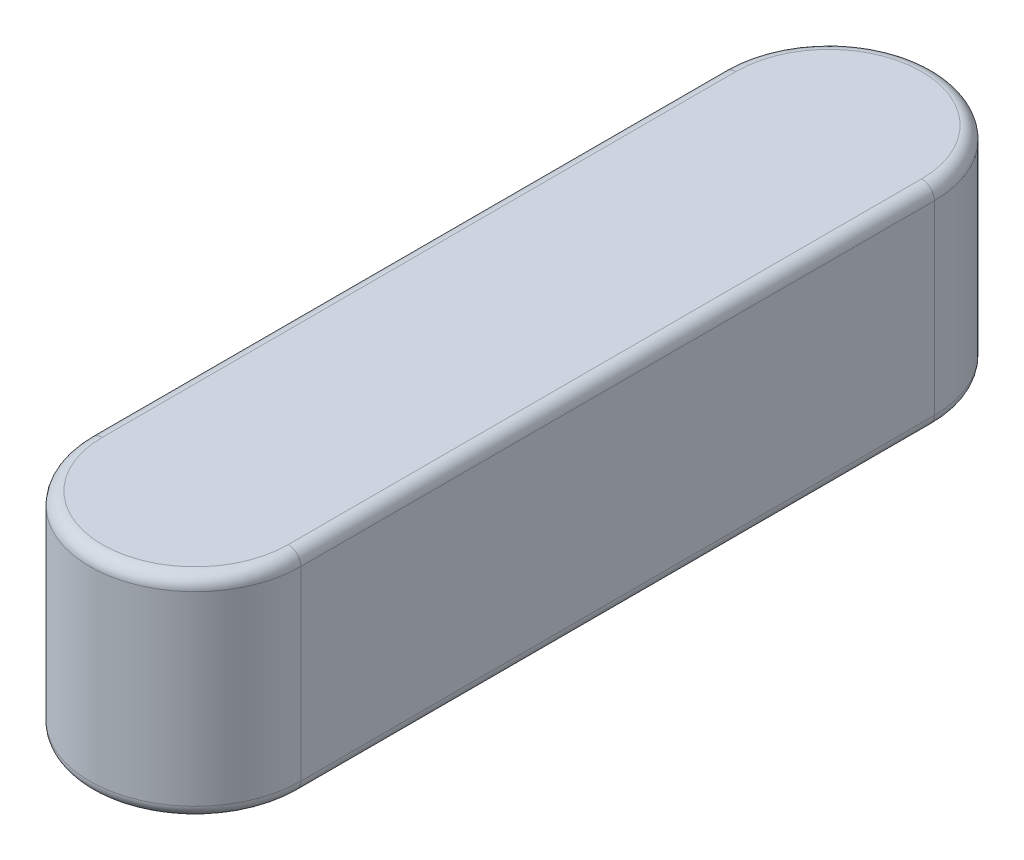
ISO-10303-21;
HEADER;
FILE_DESCRIPTION(('STEP AP214'),'2;1');
FILE_NAME('part.step','',(''),(''),'','','');
FILE_SCHEMA(('AUTOMOTIVE_DESIGN { 1 0 10303 214 1 1 1 1 }'));
ENDSEC;
DATA;
#1=APPLICATION_CONTEXT('core data for automotive mechanical design processes');
#2=APPLICATION_PROTOCOL_DEFINITION('international standard','automotive_design',2000,#1);
#3=PRODUCT_CONTEXT('',#1,'mechanical');
#4=PRODUCT('Part','Part','',(#3));
#5=PRODUCT_RELATED_PRODUCT_CATEGORY('part','',(#4));
#6=PRODUCT_DEFINITION_FORMATION('','',#4);
#7=PRODUCT_DEFINITION_CONTEXT('part definition',#1,'design');
#8=PRODUCT_DEFINITION('design','',#6,#7);
#9=PRODUCT_DEFINITION_SHAPE('','',#8);
#10=(LENGTH_UNIT() NAMED_UNIT(*) SI_UNIT(.MILLI.,.METRE.));
#11=(NAMED_UNIT(*) PLANE_ANGLE_UNIT() SI_UNIT($,.RADIAN.));
#12=(NAMED_UNIT(*) SI_UNIT($,.STERADIAN.) SOLID_ANGLE_UNIT());
#13=UNCERTAINTY_MEASURE_WITH_UNIT(LENGTH_MEASURE(1.E-05),#10,'distance_accuracy_value','');
#14=(GEOMETRIC_REPRESENTATION_CONTEXT(3) GLOBAL_UNCERTAINTY_ASSIGNED_CONTEXT((#13)) GLOBAL_UNIT_ASSIGNED_CONTEXT((#10,
#11,#12)) REPRESENTATION_CONTEXT('',''));
#15=CARTESIAN_POINT('',(0.,0.,0.));
#16=DIRECTION('',(0.,0.,1.));
#17=DIRECTION('',(1.,0.,0.));
#18=AXIS2_PLACEMENT_3D('',#15,#16,#17);
#19=CARTESIAN_POINT('',(0.,-2.5,-7.5));
#20=DIRECTION('',(0.,1.,0.));
#21=DIRECTION('',(0.,0.,1.));
#22=AXIS2_PLACEMENT_3D('',#19,#20,#21);
#23=CYLINDRICAL_SURFACE('',#22,2.5);
#24=DIRECTION('',(0.,-1.,0.));
#25=VECTOR('',#24,1.);
#26=CARTESIAN_POINT('',(2.5,-2.5,-7.5));
#27=LINE('',#26,#25);
#28=CARTESIAN_POINT('',(2.5,-2.2,-7.5));
#29=VERTEX_POINT('',#28);
#30=CARTESIAN_POINT('',(2.5,2.2,-7.5));
#31=VERTEX_POINT('',#30);
#32=EDGE_CURVE('E183',#29,#31,#27,.F.);
#33=ORIENTED_EDGE('',*,*,#32,.F.);
#34=CARTESIAN_POINT('',(0.,-2.2,-7.5));
#35=DIRECTION('',(0.,1.,0.));
#36=DIRECTION('',(0.,0.,1.));
#37=AXIS2_PLACEMENT_3D('',#34,#35,#36);
#38=CIRCLE('',#37,2.5);
#39=CARTESIAN_POINT('',(-2.5,-2.2,-7.5));
#40=VERTEX_POINT('',#39);
#41=EDGE_CURVE('E148',#29,#40,#38,.T.);
#42=ORIENTED_EDGE('',*,*,#41,.T.);
#43=DIRECTION('',(0.,-1.,0.));
#44=VECTOR('',#43,1.);
#45=CARTESIAN_POINT('',(-2.5,-2.5,-7.5));
#46=LINE('',#45,#44);
#47=CARTESIAN_POINT('',(-2.5,2.2,-7.5));
#48=VERTEX_POINT('',#47);
#49=EDGE_CURVE('E128',#48,#40,#46,.T.);
#50=ORIENTED_EDGE('',*,*,#49,.F.);
#51=CARTESIAN_POINT('',(0.,2.2,-7.5));
#52=DIRECTION('',(0.,-1.,0.));
#53=DIRECTION('',(0.,0.,-1.));
#54=AXIS2_PLACEMENT_3D('',#51,#52,#53);
#55=CIRCLE('',#54,2.5);
#56=EDGE_CURVE('E146',#48,#31,#55,.T.);
#57=ORIENTED_EDGE('',*,*,#56,.T.);
#58=EDGE_LOOP('',(#33,#42,#50,#57));
#59=FACE_BOUND('',#58,.T.);
#60=ADVANCED_FACE('F43',(#59),#23,.T.);
#61=CARTESIAN_POINT('',(0.,2.5,7.5));
#62=DIRECTION('',(0.,1.,0.));
#63=DIRECTION('',(0.,0.,1.));
#64=AXIS2_PLACEMENT_3D('',#61,#62,#63);
#65=CYLINDRICAL_SURFACE('',#64,2.5);
#66=DIRECTION('',(0.,1.,0.));
#67=VECTOR('',#66,1.);
#68=CARTESIAN_POINT('',(-2.5,-2.5,7.5));
#69=LINE('',#68,#67);
#70=CARTESIAN_POINT('',(-2.5,-2.2,7.5));
#71=VERTEX_POINT('',#70);
#72=CARTESIAN_POINT('',(-2.5,2.2,7.5));
#73=VERTEX_POINT('',#72);
#74=EDGE_CURVE('E191',#71,#73,#69,.T.);
#75=ORIENTED_EDGE('',*,*,#74,.F.);
#76=CARTESIAN_POINT('',(0.,-2.2,7.5));
#77=DIRECTION('',(0.,1.,0.));
#78=DIRECTION('',(0.,0.,1.));
#79=AXIS2_PLACEMENT_3D('',#76,#77,#78);
#80=CIRCLE('',#79,2.5);
#81=CARTESIAN_POINT('',(2.5,-2.2,7.5));
#82=VERTEX_POINT('',#81);
#83=EDGE_CURVE('E115',#71,#82,#80,.T.);
#84=ORIENTED_EDGE('',*,*,#83,.T.);
#85=DIRECTION('',(0.,1.,0.));
#86=VECTOR('',#85,1.);
#87=CARTESIAN_POINT('',(2.5,-2.5,7.5));
#88=LINE('',#87,#86);
#89=CARTESIAN_POINT('',(2.5,2.2,7.5));
#90=VERTEX_POINT('',#89);
#91=EDGE_CURVE('E163',#90,#82,#88,.F.);
#92=ORIENTED_EDGE('',*,*,#91,.F.);
#93=CARTESIAN_POINT('',(0.,2.2,7.5));
#94=DIRECTION('',(0.,-1.,0.));
#95=DIRECTION('',(0.,0.,-1.));
#96=AXIS2_PLACEMENT_3D('',#93,#94,#95);
#97=CIRCLE('',#96,2.5);
#98=EDGE_CURVE('E134',#90,#73,#97,.T.);
#99=ORIENTED_EDGE('',*,*,#98,.T.);
#100=EDGE_LOOP('',(#75,#84,#92,#99));
#101=FACE_BOUND('',#100,.T.);
#102=ADVANCED_FACE('F204',(#101),#65,.T.);
#103=CARTESIAN_POINT('',(2.5,-2.5,10.));
#104=DIRECTION('',(-1.,0.,0.));
#105=DIRECTION('',(0.,0.,1.));
#106=AXIS2_PLACEMENT_3D('',#103,#104,#105);
#107=PLANE('',#106);
#108=ORIENTED_EDGE('',*,*,#91,.T.);
#109=DIRECTION('',(0.,0.,-1.));
#110=VECTOR('',#109,1.);
#111=CARTESIAN_POINT('',(2.5,-2.2,10.));
#112=LINE('',#111,#110);
#113=EDGE_CURVE('E144',#82,#29,#112,.T.);
#114=ORIENTED_EDGE('',*,*,#113,.T.);
#115=ORIENTED_EDGE('',*,*,#32,.T.);
#116=DIRECTION('',(0.,0.,-1.));
#117=VECTOR('',#116,1.);
#118=CARTESIAN_POINT('',(2.5,2.2,10.));
#119=LINE('',#118,#117);
#120=EDGE_CURVE('E142',#31,#90,#119,.F.);
#121=ORIENTED_EDGE('',*,*,#120,.T.);
#122=EDGE_LOOP('',(#108,#114,#115,#121));
#123=FACE_BOUND('',#122,.T.);
#124=ADVANCED_FACE('F188',(#123),#107,.F.);
#125=CARTESIAN_POINT('',(-2.5,2.5,10.));
#126=DIRECTION('',(0.,-1.,0.));
#127=DIRECTION('',(0.,0.,-1.));
#128=AXIS2_PLACEMENT_3D('',#125,#126,#127);
#129=PLANE('',#128);
#130=DIRECTION('',(0.,0.,-1.));
#131=VECTOR('',#130,1.);
#132=CARTESIAN_POINT('',(-2.2,2.5,10.));
#133=LINE('',#132,#131);
#134=CARTESIAN_POINT('',(-2.2,2.5,-7.5));
#135=VERTEX_POINT('',#134);
#136=CARTESIAN_POINT('',(-2.2,2.5,7.5));
#137=VERTEX_POINT('',#136);
#138=EDGE_CURVE('E52',#135,#137,#133,.F.);
#139=ORIENTED_EDGE('',*,*,#138,.T.);
#140=CARTESIAN_POINT('',(0.,2.5,7.5));
#141=DIRECTION('',(0.,-1.,0.));
#142=DIRECTION('',(0.,0.,-1.));
#143=AXIS2_PLACEMENT_3D('',#140,#141,#142);
#144=CIRCLE('',#143,2.2);
#145=CARTESIAN_POINT('',(2.2,2.5,7.5));
#146=VERTEX_POINT('',#145);
#147=EDGE_CURVE('E11',#137,#146,#144,.F.);
#148=ORIENTED_EDGE('',*,*,#147,.T.);
#149=DIRECTION('',(0.,0.,-1.));
#150=VECTOR('',#149,1.);
#151=CARTESIAN_POINT('',(2.2,2.5,10.));
#152=LINE('',#151,#150);
#153=CARTESIAN_POINT('',(2.2,2.5,-7.5));
#154=VERTEX_POINT('',#153);
#155=EDGE_CURVE('E154',#146,#154,#152,.T.);
#156=ORIENTED_EDGE('',*,*,#155,.T.);
#157=CARTESIAN_POINT('',(0.,2.5,-7.5));
#158=DIRECTION('',(0.,-1.,0.));
#159=DIRECTION('',(0.,0.,-1.));
#160=AXIS2_PLACEMENT_3D('',#157,#158,#159);
#161=CIRCLE('',#160,2.2);
#162=EDGE_CURVE('E63',#154,#135,#161,.F.);
#163=ORIENTED_EDGE('',*,*,#162,.T.);
#164=EDGE_LOOP('',(#139,#148,#156,#163));
#165=FACE_BOUND('',#164,.T.);
#166=ADVANCED_FACE('F209',(#165),#129,.F.);
#167=CARTESIAN_POINT('',(-2.5,-2.5,10.));
#168=DIRECTION('',(1.,0.,0.));
#169=DIRECTION('',(0.,0.,-1.));
#170=AXIS2_PLACEMENT_3D('',#167,#168,#169);
#171=PLANE('',#170);
#172=ORIENTED_EDGE('',*,*,#49,.T.);
#173=DIRECTION('',(0.,0.,-1.));
#174=VECTOR('',#173,1.);
#175=CARTESIAN_POINT('',(-2.5,-2.2,10.));
#176=LINE('',#175,#174);
#177=EDGE_CURVE('E152',#40,#71,#176,.F.);
#178=ORIENTED_EDGE('',*,*,#177,.T.);
#179=ORIENTED_EDGE('',*,*,#74,.T.);
#180=DIRECTION('',(0.,0.,-1.));
#181=VECTOR('',#180,1.);
#182=CARTESIAN_POINT('',(-2.5,2.2,10.));
#183=LINE('',#182,#181);
#184=EDGE_CURVE('E150',#73,#48,#183,.T.);
#185=ORIENTED_EDGE('',*,*,#184,.T.);
#186=EDGE_LOOP('',(#172,#178,#179,#185));
#187=FACE_BOUND('',#186,.T.);
#188=ADVANCED_FACE('F207',(#187),#171,.F.);
#189=CARTESIAN_POINT('',(-2.5,-2.5,10.));
#190=DIRECTION('',(0.,1.,0.));
#191=DIRECTION('',(0.,0.,1.));
#192=AXIS2_PLACEMENT_3D('',#189,#190,#191);
#193=PLANE('',#192);
#194=DIRECTION('',(0.,0.,-1.));
#195=VECTOR('',#194,1.);
#196=CARTESIAN_POINT('',(2.2,-2.5,10.));
#197=LINE('',#196,#195);
#198=CARTESIAN_POINT('',(2.2,-2.5,-7.5));
#199=VERTEX_POINT('',#198);
#200=CARTESIAN_POINT('',(2.2,-2.5,7.5));
#201=VERTEX_POINT('',#200);
#202=EDGE_CURVE('E132',#199,#201,#197,.F.);
#203=ORIENTED_EDGE('',*,*,#202,.T.);
#204=CARTESIAN_POINT('',(0.,-2.5,7.5));
#205=DIRECTION('',(0.,1.,0.));
#206=DIRECTION('',(0.,0.,1.));
#207=AXIS2_PLACEMENT_3D('',#204,#205,#206);
#208=CIRCLE('',#207,2.2);
#209=CARTESIAN_POINT('',(-2.2,-2.5,7.5));
#210=VERTEX_POINT('',#209);
#211=EDGE_CURVE('E113',#201,#210,#208,.F.);
#212=ORIENTED_EDGE('',*,*,#211,.T.);
#213=DIRECTION('',(0.,0.,-1.));
#214=VECTOR('',#213,1.);
#215=CARTESIAN_POINT('',(-2.2,-2.5,10.));
#216=LINE('',#215,#214);
#217=CARTESIAN_POINT('',(-2.2,-2.5,-7.5));
#218=VERTEX_POINT('',#217);
#219=EDGE_CURVE('E121',#210,#218,#216,.T.);
#220=ORIENTED_EDGE('',*,*,#219,.T.);
#221=CARTESIAN_POINT('',(0.,-2.5,-7.5));
#222=DIRECTION('',(0.,1.,0.));
#223=DIRECTION('',(0.,0.,1.));
#224=AXIS2_PLACEMENT_3D('',#221,#222,#223);
#225=CIRCLE('',#224,2.2);
#226=EDGE_CURVE('E127',#218,#199,#225,.F.);
#227=ORIENTED_EDGE('',*,*,#226,.T.);
#228=EDGE_LOOP('',(#203,#212,#220,#227));
#229=FACE_BOUND('',#228,.T.);
#230=ADVANCED_FACE('F130',(#229),#193,.F.);
#231=CARTESIAN_POINT('',(0.,-2.2,-7.5));
#232=DIRECTION('',(0.,1.,0.));
#233=DIRECTION('',(0.,0.,1.));
#234=AXIS2_PLACEMENT_3D('',#231,#232,#233);
#235=TOROIDAL_SURFACE('',#234,2.2,0.3);
#236=CARTESIAN_POINT('',(-2.2,-2.2,-7.5));
#237=DIRECTION('',(0.,0.,1.));
#238=DIRECTION('',(1.,0.,0.));
#239=AXIS2_PLACEMENT_3D('',#236,#237,#238);
#240=CIRCLE('',#239,0.3);
#241=EDGE_CURVE('E124',#40,#218,#240,.T.);
#242=ORIENTED_EDGE('',*,*,#241,.F.);
#243=ORIENTED_EDGE('',*,*,#41,.F.);
#244=CARTESIAN_POINT('',(2.2,-2.2,-7.5));
#245=DIRECTION('',(0.,0.,1.));
#246=DIRECTION('',(1.,0.,0.));
#247=AXIS2_PLACEMENT_3D('',#244,#245,#246);
#248=CIRCLE('',#247,0.3);
#249=EDGE_CURVE('E160',#199,#29,#248,.T.);
#250=ORIENTED_EDGE('',*,*,#249,.F.);
#251=ORIENTED_EDGE('',*,*,#226,.F.);
#252=EDGE_LOOP('',(#242,#243,#250,#251));
#253=FACE_BOUND('',#252,.T.);
#254=ADVANCED_FACE('F199',(#253),#235,.T.);
#255=CARTESIAN_POINT('',(2.2,-2.2,10.));
#256=DIRECTION('',(0.,0.,-1.));
#257=DIRECTION('',(-1.,0.,0.));
#258=AXIS2_PLACEMENT_3D('',#255,#256,#257);
#259=CYLINDRICAL_SURFACE('',#258,0.3);
#260=ORIENTED_EDGE('',*,*,#249,.T.);
#261=ORIENTED_EDGE('',*,*,#113,.F.);
#262=CARTESIAN_POINT('',(2.2,-2.2,7.5));
#263=DIRECTION('',(0.,0.,1.));
#264=DIRECTION('',(1.,0.,0.));
#265=AXIS2_PLACEMENT_3D('',#262,#263,#264);
#266=CIRCLE('',#265,0.3);
#267=EDGE_CURVE('E118',#201,#82,#266,.T.);
#268=ORIENTED_EDGE('',*,*,#267,.F.);
#269=ORIENTED_EDGE('',*,*,#202,.F.);
#270=EDGE_LOOP('',(#260,#261,#268,#269));
#271=FACE_BOUND('',#270,.T.);
#272=ADVANCED_FACE('F201',(#271),#259,.T.);
#273=CARTESIAN_POINT('',(-2.2,-2.2,10.));
#274=DIRECTION('',(0.,0.,-1.));
#275=DIRECTION('',(-1.,0.,0.));
#276=AXIS2_PLACEMENT_3D('',#273,#274,#275);
#277=CYLINDRICAL_SURFACE('',#276,0.3);
#278=ORIENTED_EDGE('',*,*,#241,.T.);
#279=ORIENTED_EDGE('',*,*,#219,.F.);
#280=CARTESIAN_POINT('',(-2.2,-2.2,7.5));
#281=DIRECTION('',(0.,0.,1.));
#282=DIRECTION('',(1.,0.,0.));
#283=AXIS2_PLACEMENT_3D('',#280,#281,#282);
#284=CIRCLE('',#283,0.3);
#285=EDGE_CURVE('E109',#71,#210,#284,.T.);
#286=ORIENTED_EDGE('',*,*,#285,.F.);
#287=ORIENTED_EDGE('',*,*,#177,.F.);
#288=EDGE_LOOP('',(#278,#279,#286,#287));
#289=FACE_BOUND('',#288,.T.);
#290=ADVANCED_FACE('F122',(#289),#277,.T.);
#291=CARTESIAN_POINT('',(0.,-2.2,7.5));
#292=DIRECTION('',(0.,1.,0.));
#293=DIRECTION('',(0.,0.,1.));
#294=AXIS2_PLACEMENT_3D('',#291,#292,#293);
#295=TOROIDAL_SURFACE('',#294,2.2,0.3);
#296=ORIENTED_EDGE('',*,*,#267,.T.);
#297=ORIENTED_EDGE('',*,*,#83,.F.);
#298=ORIENTED_EDGE('',*,*,#285,.T.);
#299=ORIENTED_EDGE('',*,*,#211,.F.);
#300=EDGE_LOOP('',(#296,#297,#298,#299));
#301=FACE_BOUND('',#300,.T.);
#302=ADVANCED_FACE('F111',(#301),#295,.T.);
#303=CARTESIAN_POINT('',(0.,2.2,-7.5));
#304=DIRECTION('',(0.,-1.,0.));
#305=DIRECTION('',(0.,0.,-1.));
#306=AXIS2_PLACEMENT_3D('',#303,#304,#305);
#307=TOROIDAL_SURFACE('',#306,2.2,0.3);
#308=CARTESIAN_POINT('',(2.2,2.2,-7.5));
#309=DIRECTION('',(0.,0.,1.));
#310=DIRECTION('',(1.,0.,0.));
#311=AXIS2_PLACEMENT_3D('',#308,#309,#310);
#312=CIRCLE('',#311,0.3);
#313=EDGE_CURVE('E167',#31,#154,#312,.T.);
#314=ORIENTED_EDGE('',*,*,#313,.F.);
#315=ORIENTED_EDGE('',*,*,#56,.F.);
#316=CARTESIAN_POINT('',(-2.2,2.2,-7.5));
#317=DIRECTION('',(0.,0.,1.));
#318=DIRECTION('',(1.,0.,0.));
#319=AXIS2_PLACEMENT_3D('',#316,#317,#318);
#320=CIRCLE('',#319,0.3);
#321=EDGE_CURVE('E47',#135,#48,#320,.T.);
#322=ORIENTED_EDGE('',*,*,#321,.F.);
#323=ORIENTED_EDGE('',*,*,#162,.F.);
#324=EDGE_LOOP('',(#314,#315,#322,#323));
#325=FACE_BOUND('',#324,.T.);
#326=ADVANCED_FACE('F45',(#325),#307,.T.);
#327=CARTESIAN_POINT('',(-2.2,2.2,10.));
#328=DIRECTION('',(0.,0.,-1.));
#329=DIRECTION('',(-1.,0.,0.));
#330=AXIS2_PLACEMENT_3D('',#327,#328,#329);
#331=CYLINDRICAL_SURFACE('',#330,0.3);
#332=ORIENTED_EDGE('',*,*,#321,.T.);
#333=ORIENTED_EDGE('',*,*,#184,.F.);
#334=CARTESIAN_POINT('',(-2.2,2.2,7.5));
#335=DIRECTION('',(0.,0.,1.));
#336=DIRECTION('',(1.,0.,0.));
#337=AXIS2_PLACEMENT_3D('',#334,#335,#336);
#338=CIRCLE('',#337,0.3);
#339=EDGE_CURVE('E166',#137,#73,#338,.T.);
#340=ORIENTED_EDGE('',*,*,#339,.F.);
#341=ORIENTED_EDGE('',*,*,#138,.F.);
#342=EDGE_LOOP('',(#332,#333,#340,#341));
#343=FACE_BOUND('',#342,.T.);
#344=ADVANCED_FACE('F176',(#343),#331,.T.);
#345=CARTESIAN_POINT('',(2.2,2.2,10.));
#346=DIRECTION('',(0.,0.,-1.));
#347=DIRECTION('',(-1.,0.,0.));
#348=AXIS2_PLACEMENT_3D('',#345,#346,#347);
#349=CYLINDRICAL_SURFACE('',#348,0.3);
#350=ORIENTED_EDGE('',*,*,#313,.T.);
#351=ORIENTED_EDGE('',*,*,#155,.F.);
#352=CARTESIAN_POINT('',(2.2,2.2,7.5));
#353=DIRECTION('',(0.,0.,1.));
#354=DIRECTION('',(1.,0.,0.));
#355=AXIS2_PLACEMENT_3D('',#352,#353,#354);
#356=CIRCLE('',#355,0.3);
#357=EDGE_CURVE('E164',#90,#146,#356,.T.);
#358=ORIENTED_EDGE('',*,*,#357,.F.);
#359=ORIENTED_EDGE('',*,*,#120,.F.);
#360=EDGE_LOOP('',(#350,#351,#358,#359));
#361=FACE_BOUND('',#360,.T.);
#362=ADVANCED_FACE('F240',(#361),#349,.T.);
#363=CARTESIAN_POINT('',(0.,2.2,7.5));
#364=DIRECTION('',(0.,-1.,0.));
#365=DIRECTION('',(0.,0.,-1.));
#366=AXIS2_PLACEMENT_3D('',#363,#364,#365);
#367=TOROIDAL_SURFACE('',#366,2.2,0.3);
#368=ORIENTED_EDGE('',*,*,#339,.T.);
#369=ORIENTED_EDGE('',*,*,#98,.F.);
#370=ORIENTED_EDGE('',*,*,#357,.T.);
#371=ORIENTED_EDGE('',*,*,#147,.F.);
#372=EDGE_LOOP('',(#368,#369,#370,#371));
#373=FACE_BOUND('',#372,.T.);
#374=ADVANCED_FACE('F237',(#373),#367,.T.);
#375=CLOSED_SHELL('',(#60,#102,#124,#166,#188,#230,#254,#272,#290,#302,#326,#344,#362,#374));
#376=MANIFOLD_SOLID_BREP('B2',#375);
#377=ADVANCED_BREP_SHAPE_REPRESENTATION('',(#18,#376),#14);
#378=SHAPE_DEFINITION_REPRESENTATION(#9,#377);
ENDSEC;
END-ISO-10303-21;
